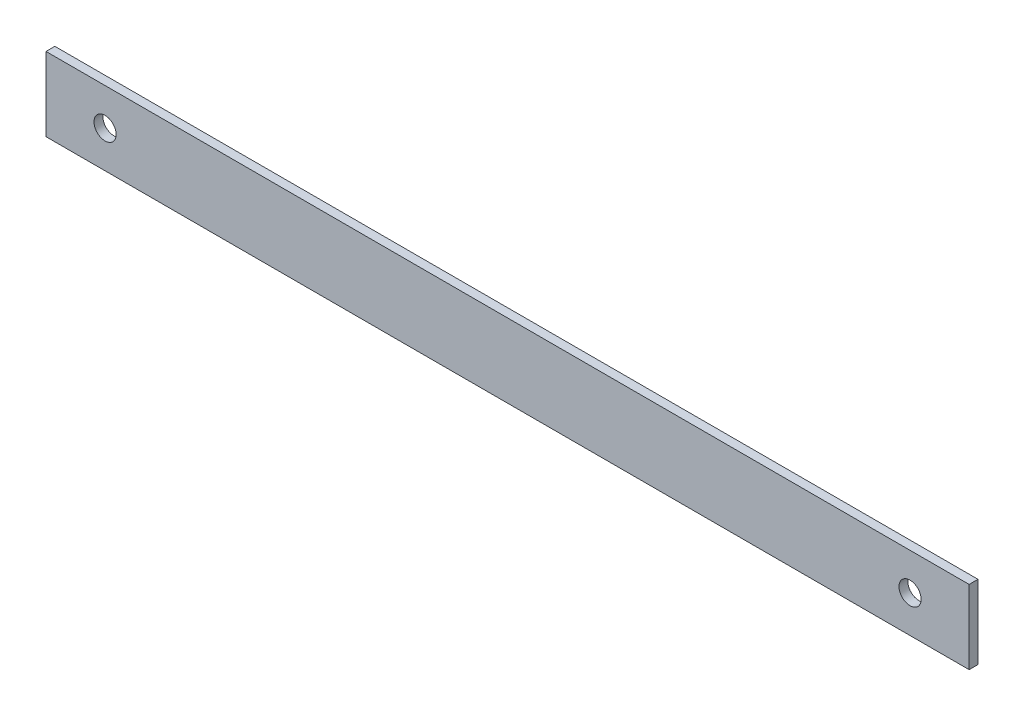
ISO-10303-21;
HEADER;
FILE_DESCRIPTION(('STEP AP214'),'2;1');
FILE_NAME('part.step','',(''),(''),'','','');
FILE_SCHEMA(('AUTOMOTIVE_DESIGN { 1 0 10303 214 1 1 1 1 }'));
ENDSEC;
DATA;
#1=APPLICATION_CONTEXT('core data for automotive mechanical design processes');
#2=APPLICATION_PROTOCOL_DEFINITION('international standard','automotive_design',2000,#1);
#3=PRODUCT_CONTEXT('',#1,'mechanical');
#4=PRODUCT('Part','Part','',(#3));
#5=PRODUCT_RELATED_PRODUCT_CATEGORY('part','',(#4));
#6=PRODUCT_DEFINITION_FORMATION('','',#4);
#7=PRODUCT_DEFINITION_CONTEXT('part definition',#1,'design');
#8=PRODUCT_DEFINITION('design','',#6,#7);
#9=PRODUCT_DEFINITION_SHAPE('','',#8);
#10=(LENGTH_UNIT() NAMED_UNIT(*) SI_UNIT(.MILLI.,.METRE.));
#11=(NAMED_UNIT(*) PLANE_ANGLE_UNIT() SI_UNIT($,.RADIAN.));
#12=(NAMED_UNIT(*) SI_UNIT($,.STERADIAN.) SOLID_ANGLE_UNIT());
#13=UNCERTAINTY_MEASURE_WITH_UNIT(LENGTH_MEASURE(1.E-05),#10,'distance_accuracy_value','');
#14=(GEOMETRIC_REPRESENTATION_CONTEXT(3) GLOBAL_UNCERTAINTY_ASSIGNED_CONTEXT((#13)) GLOBAL_UNIT_ASSIGNED_CONTEXT((#10,
#11,#12)) REPRESENTATION_CONTEXT('',''));
#15=CARTESIAN_POINT('',(0.,0.,0.));
#16=DIRECTION('',(0.,0.,1.));
#17=DIRECTION('',(1.,0.,0.));
#18=AXIS2_PLACEMENT_3D('',#15,#16,#17);
#19=CARTESIAN_POINT('',(0.,10.,1.2));
#20=DIRECTION('',(1.,0.,0.));
#21=DIRECTION('',(0.,0.,-1.));
#22=AXIS2_PLACEMENT_3D('',#19,#20,#21);
#23=PLANE('',#22);
#24=DIRECTION('',(0.,-1.,0.));
#25=VECTOR('',#24,1.);
#26=CARTESIAN_POINT('',(0.,10.,0.));
#27=LINE('',#26,#25);
#28=CARTESIAN_POINT('',(0.,10.,0.));
#29=VERTEX_POINT('',#28);
#30=CARTESIAN_POINT('',(0.,0.,0.));
#31=VERTEX_POINT('',#30);
#32=EDGE_CURVE('E110',#29,#31,#27,.T.);
#33=ORIENTED_EDGE('',*,*,#32,.T.);
#34=DIRECTION('',(0.,0.,-1.));
#35=VECTOR('',#34,1.);
#36=CARTESIAN_POINT('',(0.,0.,1.2));
#37=LINE('',#36,#35);
#38=CARTESIAN_POINT('',(0.,0.,1.2));
#39=VERTEX_POINT('',#38);
#40=EDGE_CURVE('E11',#39,#31,#37,.T.);
#41=ORIENTED_EDGE('',*,*,#40,.F.);
#42=DIRECTION('',(0.,-1.,0.));
#43=VECTOR('',#42,1.);
#44=CARTESIAN_POINT('',(0.,10.,1.2));
#45=LINE('',#44,#43);
#46=CARTESIAN_POINT('',(0.,10.,1.2));
#47=VERTEX_POINT('',#46);
#48=EDGE_CURVE('E94',#47,#39,#45,.T.);
#49=ORIENTED_EDGE('',*,*,#48,.F.);
#50=DIRECTION('',(0.,0.,-1.));
#51=VECTOR('',#50,1.);
#52=CARTESIAN_POINT('',(0.,10.,1.2));
#53=LINE('',#52,#51);
#54=EDGE_CURVE('E103',#47,#29,#53,.T.);
#55=ORIENTED_EDGE('',*,*,#54,.T.);
#56=EDGE_LOOP('',(#33,#41,#49,#55));
#57=FACE_BOUND('',#56,.T.);
#58=ADVANCED_FACE('F41',(#57),#23,.F.);
#59=CARTESIAN_POINT('',(0.,0.,1.2));
#60=DIRECTION('',(0.,1.,0.));
#61=DIRECTION('',(0.,0.,1.));
#62=AXIS2_PLACEMENT_3D('',#59,#60,#61);
#63=PLANE('',#62);
#64=DIRECTION('',(1.,0.,0.));
#65=VECTOR('',#64,1.);
#66=CARTESIAN_POINT('',(0.,0.,0.));
#67=LINE('',#66,#65);
#68=CARTESIAN_POINT('',(125.,0.,0.));
#69=VERTEX_POINT('',#68);
#70=EDGE_CURVE('E98',#31,#69,#67,.T.);
#71=ORIENTED_EDGE('',*,*,#70,.T.);
#72=DIRECTION('',(0.,0.,-1.));
#73=VECTOR('',#72,1.);
#74=CARTESIAN_POINT('',(125.,0.,1.2));
#75=LINE('',#74,#73);
#76=CARTESIAN_POINT('',(125.,0.,1.2));
#77=VERTEX_POINT('',#76);
#78=EDGE_CURVE('E49',#77,#69,#75,.T.);
#79=ORIENTED_EDGE('',*,*,#78,.F.);
#80=DIRECTION('',(1.,0.,0.));
#81=VECTOR('',#80,1.);
#82=CARTESIAN_POINT('',(0.,0.,1.2));
#83=LINE('',#82,#81);
#84=EDGE_CURVE('E90',#39,#77,#83,.T.);
#85=ORIENTED_EDGE('',*,*,#84,.F.);
#86=ORIENTED_EDGE('',*,*,#40,.T.);
#87=EDGE_LOOP('',(#71,#79,#85,#86));
#88=FACE_BOUND('',#87,.T.);
#89=ADVANCED_FACE('F100',(#88),#63,.F.);
#90=CARTESIAN_POINT('',(125.,0.,1.2));
#91=DIRECTION('',(-1.,0.,0.));
#92=DIRECTION('',(0.,0.,1.));
#93=AXIS2_PLACEMENT_3D('',#90,#91,#92);
#94=PLANE('',#93);
#95=DIRECTION('',(0.,1.,0.));
#96=VECTOR('',#95,1.);
#97=CARTESIAN_POINT('',(125.,0.,0.));
#98=LINE('',#97,#96);
#99=CARTESIAN_POINT('',(125.,10.,0.));
#100=VERTEX_POINT('',#99);
#101=EDGE_CURVE('E77',#69,#100,#98,.T.);
#102=ORIENTED_EDGE('',*,*,#101,.T.);
#103=DIRECTION('',(0.,0.,-1.));
#104=VECTOR('',#103,1.);
#105=CARTESIAN_POINT('',(125.,10.,1.2));
#106=LINE('',#105,#104);
#107=CARTESIAN_POINT('',(125.,10.,1.2));
#108=VERTEX_POINT('',#107);
#109=EDGE_CURVE('E97',#108,#100,#106,.T.);
#110=ORIENTED_EDGE('',*,*,#109,.F.);
#111=DIRECTION('',(0.,1.,0.));
#112=VECTOR('',#111,1.);
#113=CARTESIAN_POINT('',(125.,0.,1.2));
#114=LINE('',#113,#112);
#115=EDGE_CURVE('E95',#77,#108,#114,.T.);
#116=ORIENTED_EDGE('',*,*,#115,.F.);
#117=ORIENTED_EDGE('',*,*,#78,.T.);
#118=EDGE_LOOP('',(#102,#110,#116,#117));
#119=FACE_BOUND('',#118,.T.);
#120=ADVANCED_FACE('F101',(#119),#94,.F.);
#121=CARTESIAN_POINT('',(125.,10.,1.2));
#122=DIRECTION('',(0.,-1.,0.));
#123=DIRECTION('',(0.,0.,-1.));
#124=AXIS2_PLACEMENT_3D('',#121,#122,#123);
#125=PLANE('',#124);
#126=DIRECTION('',(-1.,0.,0.));
#127=VECTOR('',#126,1.);
#128=CARTESIAN_POINT('',(125.,10.,0.));
#129=LINE('',#128,#127);
#130=EDGE_CURVE('E82',#100,#29,#129,.T.);
#131=ORIENTED_EDGE('',*,*,#130,.T.);
#132=ORIENTED_EDGE('',*,*,#54,.F.);
#133=DIRECTION('',(-1.,0.,0.));
#134=VECTOR('',#133,1.);
#135=CARTESIAN_POINT('',(125.,10.,1.2));
#136=LINE('',#135,#134);
#137=EDGE_CURVE('E56',#108,#47,#136,.T.);
#138=ORIENTED_EDGE('',*,*,#137,.F.);
#139=ORIENTED_EDGE('',*,*,#109,.T.);
#140=EDGE_LOOP('',(#131,#132,#138,#139));
#141=FACE_BOUND('',#140,.T.);
#142=ADVANCED_FACE('F133',(#141),#125,.F.);
#143=CARTESIAN_POINT('',(0.,0.,1.2));
#144=DIRECTION('',(0.,0.,1.));
#145=DIRECTION('',(1.,0.,0.));
#146=AXIS2_PLACEMENT_3D('',#143,#144,#145);
#147=PLANE('',#146);
#148=CARTESIAN_POINT('',(8.,5.,1.2));
#149=DIRECTION('',(0.,0.,1.));
#150=DIRECTION('',(1.,0.,0.));
#151=AXIS2_PLACEMENT_3D('',#148,#149,#150);
#152=CIRCLE('',#151,1.5);
#153=CARTESIAN_POINT('',(9.5,5.,1.2));
#154=VERTEX_POINT('',#153);
#155=EDGE_CURVE('E109',#154,#154,#152,.T.);
#156=ORIENTED_EDGE('',*,*,#155,.F.);
#157=EDGE_LOOP('',(#156));
#158=FACE_BOUND('',#157,.T.);
#159=CARTESIAN_POINT('',(117.,5.,1.2));
#160=DIRECTION('',(0.,0.,1.));
#161=DIRECTION('',(1.,0.,0.));
#162=AXIS2_PLACEMENT_3D('',#159,#160,#161);
#163=CIRCLE('',#162,1.5);
#164=CARTESIAN_POINT('',(118.5,5.,1.2));
#165=VERTEX_POINT('',#164);
#166=EDGE_CURVE('E120',#165,#165,#163,.T.);
#167=ORIENTED_EDGE('',*,*,#166,.F.);
#168=EDGE_LOOP('',(#167));
#169=FACE_BOUND('',#168,.T.);
#170=ORIENTED_EDGE('',*,*,#48,.T.);
#171=ORIENTED_EDGE('',*,*,#84,.T.);
#172=ORIENTED_EDGE('',*,*,#115,.T.);
#173=ORIENTED_EDGE('',*,*,#137,.T.);
#174=EDGE_LOOP('',(#170,#171,#172,#173));
#175=FACE_BOUND('',#174,.T.);
#176=ADVANCED_FACE('F89',(#158,#169,#175),#147,.T.);
#177=CARTESIAN_POINT('',(0.,0.,0.));
#178=DIRECTION('',(0.,0.,1.));
#179=DIRECTION('',(1.,0.,0.));
#180=AXIS2_PLACEMENT_3D('',#177,#178,#179);
#181=PLANE('',#180);
#182=CARTESIAN_POINT('',(8.,5.,0.));
#183=DIRECTION('',(0.,0.,1.));
#184=DIRECTION('',(1.,0.,0.));
#185=AXIS2_PLACEMENT_3D('',#182,#183,#184);
#186=CIRCLE('',#185,1.5);
#187=CARTESIAN_POINT('',(9.5,5.,0.));
#188=VERTEX_POINT('',#187);
#189=EDGE_CURVE('E42',#188,#188,#186,.T.);
#190=ORIENTED_EDGE('',*,*,#189,.T.);
#191=EDGE_LOOP('',(#190));
#192=FACE_BOUND('',#191,.T.);
#193=CARTESIAN_POINT('',(117.,5.,0.));
#194=DIRECTION('',(0.,0.,1.));
#195=DIRECTION('',(1.,0.,0.));
#196=AXIS2_PLACEMENT_3D('',#193,#194,#195);
#197=CIRCLE('',#196,1.5);
#198=CARTESIAN_POINT('',(118.5,5.,0.));
#199=VERTEX_POINT('',#198);
#200=EDGE_CURVE('E113',#199,#199,#197,.T.);
#201=ORIENTED_EDGE('',*,*,#200,.T.);
#202=EDGE_LOOP('',(#201));
#203=FACE_BOUND('',#202,.T.);
#204=ORIENTED_EDGE('',*,*,#32,.F.);
#205=ORIENTED_EDGE('',*,*,#130,.F.);
#206=ORIENTED_EDGE('',*,*,#101,.F.);
#207=ORIENTED_EDGE('',*,*,#70,.F.);
#208=EDGE_LOOP('',(#204,#205,#206,#207));
#209=FACE_BOUND('',#208,.T.);
#210=ADVANCED_FACE('F131',(#192,#203,#209),#181,.F.);
#211=CARTESIAN_POINT('',(117.,5.,-5.));
#212=DIRECTION('',(0.,0.,1.));
#213=DIRECTION('',(1.,0.,0.));
#214=AXIS2_PLACEMENT_3D('',#211,#212,#213);
#215=CYLINDRICAL_SURFACE('',#214,1.5);
#216=ORIENTED_EDGE('',*,*,#166,.T.);
#217=EDGE_LOOP('',(#216));
#218=FACE_BOUND('',#217,.T.);
#219=ORIENTED_EDGE('',*,*,#200,.F.);
#220=EDGE_LOOP('',(#219));
#221=FACE_BOUND('',#220,.T.);
#222=ADVANCED_FACE('F143',(#218,#221),#215,.F.);
#223=CARTESIAN_POINT('',(8.,5.,-5.));
#224=DIRECTION('',(0.,0.,1.));
#225=DIRECTION('',(1.,0.,0.));
#226=AXIS2_PLACEMENT_3D('',#223,#224,#225);
#227=CYLINDRICAL_SURFACE('',#226,1.5);
#228=ORIENTED_EDGE('',*,*,#155,.T.);
#229=EDGE_LOOP('',(#228));
#230=FACE_BOUND('',#229,.T.);
#231=ORIENTED_EDGE('',*,*,#189,.F.);
#232=EDGE_LOOP('',(#231));
#233=FACE_BOUND('',#232,.T.);
#234=ADVANCED_FACE('F129',(#230,#233),#227,.F.);
#235=CLOSED_SHELL('',(#58,#89,#120,#142,#176,#210,#222,#234));
#236=MANIFOLD_SOLID_BREP('B2',#235);
#237=ADVANCED_BREP_SHAPE_REPRESENTATION('',(#18,#236),#14);
#238=SHAPE_DEFINITION_REPRESENTATION(#9,#237);
ENDSEC;
END-ISO-10303-21;
